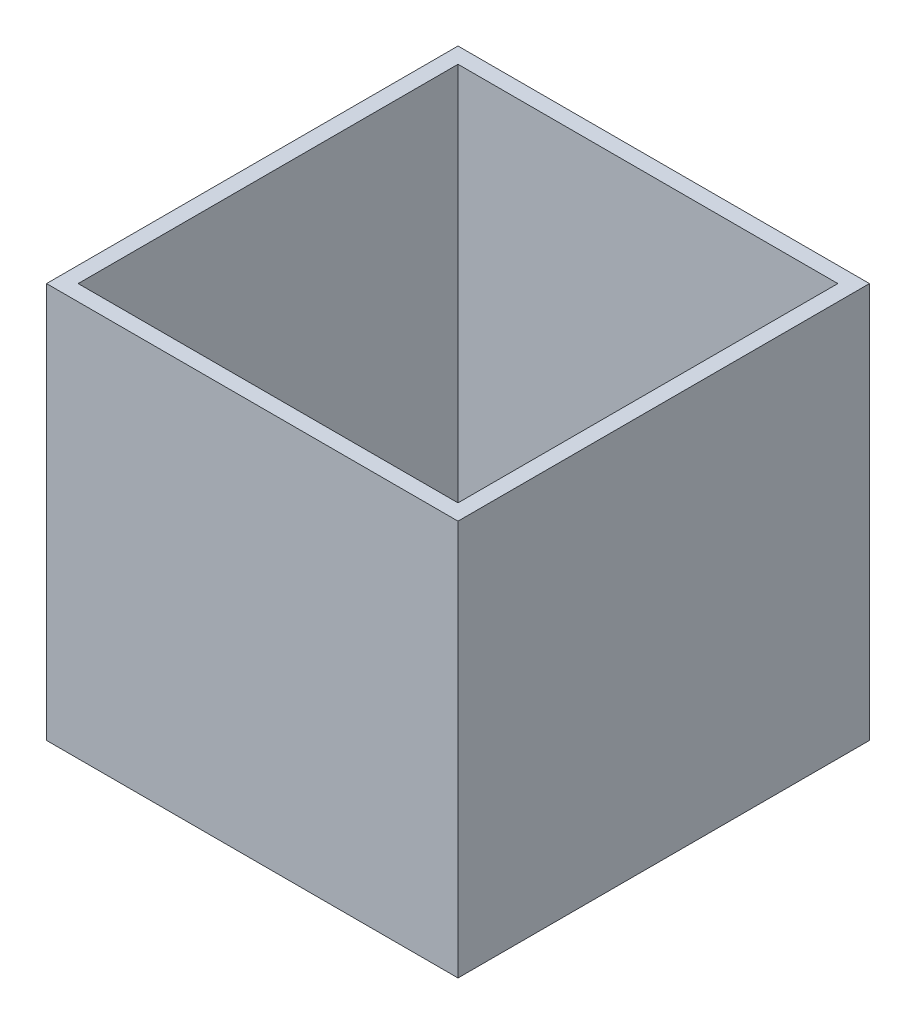
ISO-10303-21;
HEADER;
FILE_DESCRIPTION(('STEP AP214'),'2;1');
FILE_NAME('part.step','',(''),(''),'','','');
FILE_SCHEMA(('AUTOMOTIVE_DESIGN { 1 0 10303 214 1 1 1 1 }'));
ENDSEC;
DATA;
#1=APPLICATION_CONTEXT('core data for automotive mechanical design processes');
#2=APPLICATION_PROTOCOL_DEFINITION('international standard','automotive_design',2000,#1);
#3=PRODUCT_CONTEXT('',#1,'mechanical');
#4=PRODUCT('Part','Part','',(#3));
#5=PRODUCT_RELATED_PRODUCT_CATEGORY('part','',(#4));
#6=PRODUCT_DEFINITION_FORMATION('','',#4);
#7=PRODUCT_DEFINITION_CONTEXT('part definition',#1,'design');
#8=PRODUCT_DEFINITION('design','',#6,#7);
#9=PRODUCT_DEFINITION_SHAPE('','',#8);
#10=(LENGTH_UNIT() NAMED_UNIT(*) SI_UNIT(.MILLI.,.METRE.));
#11=(NAMED_UNIT(*) PLANE_ANGLE_UNIT() SI_UNIT($,.RADIAN.));
#12=(NAMED_UNIT(*) SI_UNIT($,.STERADIAN.) SOLID_ANGLE_UNIT());
#13=UNCERTAINTY_MEASURE_WITH_UNIT(LENGTH_MEASURE(1.E-05),#10,'distance_accuracy_value','');
#14=(GEOMETRIC_REPRESENTATION_CONTEXT(3) GLOBAL_UNCERTAINTY_ASSIGNED_CONTEXT((#13)) GLOBAL_UNIT_ASSIGNED_CONTEXT((#10,
#11,#12)) REPRESENTATION_CONTEXT('',''));
#15=CARTESIAN_POINT('',(0.,0.,0.));
#16=DIRECTION('',(0.,0.,1.));
#17=DIRECTION('',(1.,0.,0.));
#18=AXIS2_PLACEMENT_3D('',#15,#16,#17);
#19=CARTESIAN_POINT('',(0.,317.5,0.));
#20=DIRECTION('',(0.,-1.,0.));
#21=DIRECTION('',(0.,0.,-1.));
#22=AXIS2_PLACEMENT_3D('',#19,#20,#21);
#23=PLANE('',#22);
#24=DIRECTION('',(0.,0.,1.));
#25=VECTOR('',#24,1.);
#26=CARTESIAN_POINT('',(0.,317.5,0.));
#27=LINE('',#26,#25);
#28=CARTESIAN_POINT('',(0.,317.5,-330.2));
#29=VERTEX_POINT('',#28);
#30=CARTESIAN_POINT('',(0.,317.5,0.));
#31=VERTEX_POINT('',#30);
#32=EDGE_CURVE('E143',#29,#31,#27,.T.);
#33=ORIENTED_EDGE('',*,*,#32,.T.);
#34=DIRECTION('',(1.,0.,0.));
#35=VECTOR('',#34,1.);
#36=CARTESIAN_POINT('',(0.,317.5,0.));
#37=LINE('',#36,#35);
#38=CARTESIAN_POINT('',(330.2,317.5,0.));
#39=VERTEX_POINT('',#38);
#40=EDGE_CURVE('E87',#31,#39,#37,.T.);
#41=ORIENTED_EDGE('',*,*,#40,.T.);
#42=DIRECTION('',(0.,0.,-1.));
#43=VECTOR('',#42,1.);
#44=CARTESIAN_POINT('',(330.2,317.5,0.));
#45=LINE('',#44,#43);
#46=CARTESIAN_POINT('',(330.2,317.5,-330.2));
#47=VERTEX_POINT('',#46);
#48=EDGE_CURVE('E146',#39,#47,#45,.T.);
#49=ORIENTED_EDGE('',*,*,#48,.T.);
#50=DIRECTION('',(-1.,0.,0.));
#51=VECTOR('',#50,1.);
#52=CARTESIAN_POINT('',(0.,317.5,-330.2));
#53=LINE('',#52,#51);
#54=EDGE_CURVE('E59',#47,#29,#53,.T.);
#55=ORIENTED_EDGE('',*,*,#54,.T.);
#56=EDGE_LOOP('',(#33,#41,#49,#55));
#57=FACE_BOUND('',#56,.T.);
#58=DIRECTION('',(0.,0.,1.));
#59=VECTOR('',#58,1.);
#60=CARTESIAN_POINT('',(12.7,317.5,0.));
#61=LINE('',#60,#59);
#62=CARTESIAN_POINT('',(12.7,317.5,-317.5));
#63=VERTEX_POINT('',#62);
#64=CARTESIAN_POINT('',(12.7,317.5,-12.7));
#65=VERTEX_POINT('',#64);
#66=EDGE_CURVE('E132',#63,#65,#61,.T.);
#67=ORIENTED_EDGE('',*,*,#66,.F.);
#68=DIRECTION('',(-1.,0.,0.));
#69=VECTOR('',#68,1.);
#70=CARTESIAN_POINT('',(0.,317.5,-317.5));
#71=LINE('',#70,#69);
#72=CARTESIAN_POINT('',(317.5,317.5,-317.5));
#73=VERTEX_POINT('',#72);
#74=EDGE_CURVE('E141',#73,#63,#71,.T.);
#75=ORIENTED_EDGE('',*,*,#74,.F.);
#76=DIRECTION('',(0.,0.,-1.));
#77=VECTOR('',#76,1.);
#78=CARTESIAN_POINT('',(317.5,317.5,0.));
#79=LINE('',#78,#77);
#80=CARTESIAN_POINT('',(317.5,317.5,-12.7));
#81=VERTEX_POINT('',#80);
#82=EDGE_CURVE('E139',#81,#73,#79,.T.);
#83=ORIENTED_EDGE('',*,*,#82,.F.);
#84=DIRECTION('',(1.,0.,0.));
#85=VECTOR('',#84,1.);
#86=CARTESIAN_POINT('',(0.,317.5,-12.7));
#87=LINE('',#86,#85);
#88=EDGE_CURVE('E124',#65,#81,#87,.T.);
#89=ORIENTED_EDGE('',*,*,#88,.F.);
#90=EDGE_LOOP('',(#67,#75,#83,#89));
#91=FACE_BOUND('',#90,.T.);
#92=ADVANCED_FACE('F35',(#57,#91),#23,.F.);
#93=CARTESIAN_POINT('',(0.,317.5,0.));
#94=DIRECTION('',(1.,0.,0.));
#95=DIRECTION('',(0.,0.,-1.));
#96=AXIS2_PLACEMENT_3D('',#93,#94,#95);
#97=PLANE('',#96);
#98=DIRECTION('',(0.,0.,1.));
#99=VECTOR('',#98,1.);
#100=CARTESIAN_POINT('',(0.,0.,0.));
#101=LINE('',#100,#99);
#102=CARTESIAN_POINT('',(0.,0.,-330.2));
#103=VERTEX_POINT('',#102);
#104=CARTESIAN_POINT('',(0.,0.,0.));
#105=VERTEX_POINT('',#104);
#106=EDGE_CURVE('E150',#103,#105,#101,.T.);
#107=ORIENTED_EDGE('',*,*,#106,.T.);
#108=DIRECTION('',(0.,-1.,0.));
#109=VECTOR('',#108,1.);
#110=CARTESIAN_POINT('',(0.,317.5,0.));
#111=LINE('',#110,#109);
#112=EDGE_CURVE('E11',#31,#105,#111,.T.);
#113=ORIENTED_EDGE('',*,*,#112,.F.);
#114=ORIENTED_EDGE('',*,*,#32,.F.);
#115=DIRECTION('',(0.,-1.,0.));
#116=VECTOR('',#115,1.);
#117=CARTESIAN_POINT('',(0.,317.5,-330.2));
#118=LINE('',#117,#116);
#119=EDGE_CURVE('E149',#29,#103,#118,.T.);
#120=ORIENTED_EDGE('',*,*,#119,.T.);
#121=EDGE_LOOP('',(#107,#113,#114,#120));
#122=FACE_BOUND('',#121,.T.);
#123=ADVANCED_FACE('F37',(#122),#97,.F.);
#124=CARTESIAN_POINT('',(0.,317.5,0.));
#125=DIRECTION('',(0.,0.,-1.));
#126=DIRECTION('',(-1.,0.,0.));
#127=AXIS2_PLACEMENT_3D('',#124,#125,#126);
#128=PLANE('',#127);
#129=DIRECTION('',(1.,0.,0.));
#130=VECTOR('',#129,1.);
#131=CARTESIAN_POINT('',(0.,0.,0.));
#132=LINE('',#131,#130);
#133=CARTESIAN_POINT('',(330.2,0.,0.));
#134=VERTEX_POINT('',#133);
#135=EDGE_CURVE('E153',#105,#134,#132,.T.);
#136=ORIENTED_EDGE('',*,*,#135,.T.);
#137=DIRECTION('',(0.,-1.,0.));
#138=VECTOR('',#137,1.);
#139=CARTESIAN_POINT('',(330.2,317.5,0.));
#140=LINE('',#139,#138);
#141=EDGE_CURVE('E43',#39,#134,#140,.T.);
#142=ORIENTED_EDGE('',*,*,#141,.F.);
#143=ORIENTED_EDGE('',*,*,#40,.F.);
#144=ORIENTED_EDGE('',*,*,#112,.T.);
#145=EDGE_LOOP('',(#136,#142,#143,#144));
#146=FACE_BOUND('',#145,.T.);
#147=ADVANCED_FACE('F181',(#146),#128,.F.);
#148=CARTESIAN_POINT('',(330.2,317.5,0.));
#149=DIRECTION('',(-1.,0.,0.));
#150=DIRECTION('',(0.,0.,1.));
#151=AXIS2_PLACEMENT_3D('',#148,#149,#150);
#152=PLANE('',#151);
#153=DIRECTION('',(0.,0.,-1.));
#154=VECTOR('',#153,1.);
#155=CARTESIAN_POINT('',(330.2,0.,0.));
#156=LINE('',#155,#154);
#157=CARTESIAN_POINT('',(330.2,0.,-330.2));
#158=VERTEX_POINT('',#157);
#159=EDGE_CURVE('E155',#134,#158,#156,.T.);
#160=ORIENTED_EDGE('',*,*,#159,.T.);
#161=DIRECTION('',(0.,-1.,0.));
#162=VECTOR('',#161,1.);
#163=CARTESIAN_POINT('',(330.2,317.5,-330.2));
#164=LINE('',#163,#162);
#165=EDGE_CURVE('E159',#47,#158,#164,.T.);
#166=ORIENTED_EDGE('',*,*,#165,.F.);
#167=ORIENTED_EDGE('',*,*,#48,.F.);
#168=ORIENTED_EDGE('',*,*,#141,.T.);
#169=EDGE_LOOP('',(#160,#166,#167,#168));
#170=FACE_BOUND('',#169,.T.);
#171=ADVANCED_FACE('F164',(#170),#152,.F.);
#172=CARTESIAN_POINT('',(0.,317.5,-330.2));
#173=DIRECTION('',(0.,0.,1.));
#174=DIRECTION('',(1.,0.,0.));
#175=AXIS2_PLACEMENT_3D('',#172,#173,#174);
#176=PLANE('',#175);
#177=DIRECTION('',(-1.,0.,0.));
#178=VECTOR('',#177,1.);
#179=CARTESIAN_POINT('',(0.,0.,-330.2));
#180=LINE('',#179,#178);
#181=EDGE_CURVE('E80',#158,#103,#180,.T.);
#182=ORIENTED_EDGE('',*,*,#181,.T.);
#183=ORIENTED_EDGE('',*,*,#119,.F.);
#184=ORIENTED_EDGE('',*,*,#54,.F.);
#185=ORIENTED_EDGE('',*,*,#165,.T.);
#186=EDGE_LOOP('',(#182,#183,#184,#185));
#187=FACE_BOUND('',#186,.T.);
#188=ADVANCED_FACE('F172',(#187),#176,.F.);
#189=CARTESIAN_POINT('',(0.,0.,0.));
#190=DIRECTION('',(0.,-1.,0.));
#191=DIRECTION('',(0.,0.,-1.));
#192=AXIS2_PLACEMENT_3D('',#189,#190,#191);
#193=PLANE('',#192);
#194=ORIENTED_EDGE('',*,*,#106,.F.);
#195=ORIENTED_EDGE('',*,*,#181,.F.);
#196=ORIENTED_EDGE('',*,*,#159,.F.);
#197=ORIENTED_EDGE('',*,*,#135,.F.);
#198=EDGE_LOOP('',(#194,#195,#196,#197));
#199=FACE_BOUND('',#198,.T.);
#200=ADVANCED_FACE('F168',(#199),#193,.T.);
#201=CARTESIAN_POINT('',(12.7,317.5,0.));
#202=DIRECTION('',(1.,0.,0.));
#203=DIRECTION('',(0.,0.,-1.));
#204=AXIS2_PLACEMENT_3D('',#201,#202,#203);
#205=PLANE('',#204);
#206=DIRECTION('',(0.,0.,1.));
#207=VECTOR('',#206,1.);
#208=CARTESIAN_POINT('',(12.7,12.7,0.));
#209=LINE('',#208,#207);
#210=CARTESIAN_POINT('',(12.7,12.7,-317.5));
#211=VERTEX_POINT('',#210);
#212=CARTESIAN_POINT('',(12.7,12.7,-12.7));
#213=VERTEX_POINT('',#212);
#214=EDGE_CURVE('E115',#211,#213,#209,.T.);
#215=ORIENTED_EDGE('',*,*,#214,.F.);
#216=DIRECTION('',(0.,-1.,0.));
#217=VECTOR('',#216,1.);
#218=CARTESIAN_POINT('',(12.7,317.5,-317.5));
#219=LINE('',#218,#217);
#220=EDGE_CURVE('E135',#63,#211,#219,.T.);
#221=ORIENTED_EDGE('',*,*,#220,.F.);
#222=ORIENTED_EDGE('',*,*,#66,.T.);
#223=DIRECTION('',(0.,-1.,0.));
#224=VECTOR('',#223,1.);
#225=CARTESIAN_POINT('',(12.7,317.5,-12.7));
#226=LINE('',#225,#224);
#227=EDGE_CURVE('E127',#65,#213,#226,.T.);
#228=ORIENTED_EDGE('',*,*,#227,.T.);
#229=EDGE_LOOP('',(#215,#221,#222,#228));
#230=FACE_BOUND('',#229,.T.);
#231=ADVANCED_FACE('F179',(#230),#205,.T.);
#232=CARTESIAN_POINT('',(0.,317.5,-12.7));
#233=DIRECTION('',(0.,0.,-1.));
#234=DIRECTION('',(-1.,0.,0.));
#235=AXIS2_PLACEMENT_3D('',#232,#233,#234);
#236=PLANE('',#235);
#237=DIRECTION('',(1.,0.,0.));
#238=VECTOR('',#237,1.);
#239=CARTESIAN_POINT('',(0.,12.7,-12.7));
#240=LINE('',#239,#238);
#241=CARTESIAN_POINT('',(317.5,12.7,-12.7));
#242=VERTEX_POINT('',#241);
#243=EDGE_CURVE('E109',#213,#242,#240,.T.);
#244=ORIENTED_EDGE('',*,*,#243,.F.);
#245=ORIENTED_EDGE('',*,*,#227,.F.);
#246=ORIENTED_EDGE('',*,*,#88,.T.);
#247=DIRECTION('',(0.,-1.,0.));
#248=VECTOR('',#247,1.);
#249=CARTESIAN_POINT('',(317.5,317.5,-12.7));
#250=LINE('',#249,#248);
#251=EDGE_CURVE('E121',#81,#242,#250,.T.);
#252=ORIENTED_EDGE('',*,*,#251,.T.);
#253=EDGE_LOOP('',(#244,#245,#246,#252));
#254=FACE_BOUND('',#253,.T.);
#255=ADVANCED_FACE('F122',(#254),#236,.T.);
#256=CARTESIAN_POINT('',(317.5,317.5,0.));
#257=DIRECTION('',(-1.,0.,0.));
#258=DIRECTION('',(0.,0.,1.));
#259=AXIS2_PLACEMENT_3D('',#256,#257,#258);
#260=PLANE('',#259);
#261=DIRECTION('',(0.,0.,-1.));
#262=VECTOR('',#261,1.);
#263=CARTESIAN_POINT('',(317.5,12.7,0.));
#264=LINE('',#263,#262);
#265=CARTESIAN_POINT('',(317.5,12.7,-317.5));
#266=VERTEX_POINT('',#265);
#267=EDGE_CURVE('E113',#242,#266,#264,.T.);
#268=ORIENTED_EDGE('',*,*,#267,.F.);
#269=ORIENTED_EDGE('',*,*,#251,.F.);
#270=ORIENTED_EDGE('',*,*,#82,.T.);
#271=DIRECTION('',(0.,-1.,0.));
#272=VECTOR('',#271,1.);
#273=CARTESIAN_POINT('',(317.5,317.5,-317.5));
#274=LINE('',#273,#272);
#275=EDGE_CURVE('E50',#73,#266,#274,.T.);
#276=ORIENTED_EDGE('',*,*,#275,.T.);
#277=EDGE_LOOP('',(#268,#269,#270,#276));
#278=FACE_BOUND('',#277,.T.);
#279=ADVANCED_FACE('F129',(#278),#260,.T.);
#280=CARTESIAN_POINT('',(0.,317.5,-317.5));
#281=DIRECTION('',(0.,0.,1.));
#282=DIRECTION('',(1.,0.,0.));
#283=AXIS2_PLACEMENT_3D('',#280,#281,#282);
#284=PLANE('',#283);
#285=DIRECTION('',(-1.,0.,0.));
#286=VECTOR('',#285,1.);
#287=CARTESIAN_POINT('',(0.,12.7,-317.5));
#288=LINE('',#287,#286);
#289=EDGE_CURVE('E130',#266,#211,#288,.T.);
#290=ORIENTED_EDGE('',*,*,#289,.F.);
#291=ORIENTED_EDGE('',*,*,#275,.F.);
#292=ORIENTED_EDGE('',*,*,#74,.T.);
#293=ORIENTED_EDGE('',*,*,#220,.T.);
#294=EDGE_LOOP('',(#290,#291,#292,#293));
#295=FACE_BOUND('',#294,.T.);
#296=ADVANCED_FACE('F192',(#295),#284,.T.);
#297=CARTESIAN_POINT('',(0.,12.7,0.));
#298=DIRECTION('',(0.,-1.,0.));
#299=DIRECTION('',(0.,0.,-1.));
#300=AXIS2_PLACEMENT_3D('',#297,#298,#299);
#301=PLANE('',#300);
#302=ORIENTED_EDGE('',*,*,#214,.T.);
#303=ORIENTED_EDGE('',*,*,#243,.T.);
#304=ORIENTED_EDGE('',*,*,#267,.T.);
#305=ORIENTED_EDGE('',*,*,#289,.T.);
#306=EDGE_LOOP('',(#302,#303,#304,#305));
#307=FACE_BOUND('',#306,.T.);
#308=ADVANCED_FACE('F111',(#307),#301,.F.);
#309=CLOSED_SHELL('',(#92,#123,#147,#171,#188,#200,#231,#255,#279,#296,#308));
#310=MANIFOLD_SOLID_BREP('B2',#309);
#311=ADVANCED_BREP_SHAPE_REPRESENTATION('',(#18,#310),#14);
#312=SHAPE_DEFINITION_REPRESENTATION(#9,#311);
ENDSEC;
END-ISO-10303-21;
